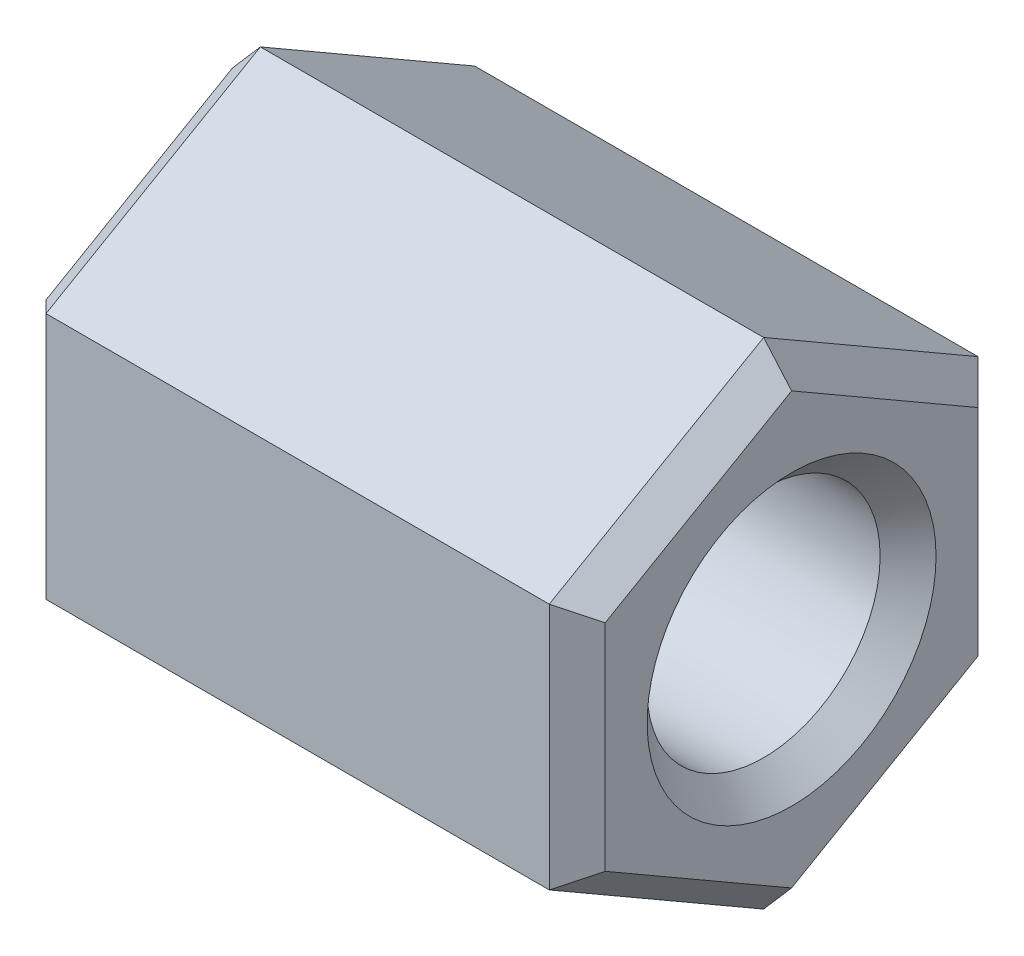
ISO-10303-21;
HEADER;
FILE_DESCRIPTION(('STEP AP214'),'2;1');
FILE_NAME('part.step','',(''),(''),'','','');
FILE_SCHEMA(('AUTOMOTIVE_DESIGN { 1 0 10303 214 1 1 1 1 }'));
ENDSEC;
DATA;
#1=APPLICATION_CONTEXT('core data for automotive mechanical design processes');
#2=APPLICATION_PROTOCOL_DEFINITION('international standard','automotive_design',2000,#1);
#3=PRODUCT_CONTEXT('',#1,'mechanical');
#4=PRODUCT('Part','Part','',(#3));
#5=PRODUCT_RELATED_PRODUCT_CATEGORY('part','',(#4));
#6=PRODUCT_DEFINITION_FORMATION('','',#4);
#7=PRODUCT_DEFINITION_CONTEXT('part definition',#1,'design');
#8=PRODUCT_DEFINITION('design','',#6,#7);
#9=PRODUCT_DEFINITION_SHAPE('','',#8);
#10=(LENGTH_UNIT() NAMED_UNIT(*) SI_UNIT(.MILLI.,.METRE.));
#11=(NAMED_UNIT(*) PLANE_ANGLE_UNIT() SI_UNIT($,.RADIAN.));
#12=(NAMED_UNIT(*) SI_UNIT($,.STERADIAN.) SOLID_ANGLE_UNIT());
#13=UNCERTAINTY_MEASURE_WITH_UNIT(LENGTH_MEASURE(1.E-05),#10,'distance_accuracy_value','');
#14=(GEOMETRIC_REPRESENTATION_CONTEXT(3) GLOBAL_UNCERTAINTY_ASSIGNED_CONTEXT((#13)) GLOBAL_UNIT_ASSIGNED_CONTEXT((#10,
#11,#12)) REPRESENTATION_CONTEXT('',''));
#15=CARTESIAN_POINT('',(0.,0.,0.));
#16=DIRECTION('',(0.,0.,1.));
#17=DIRECTION('',(1.,0.,0.));
#18=AXIS2_PLACEMENT_3D('',#15,#16,#17);
#19=CARTESIAN_POINT('',(6.,0.,0.));
#20=DIRECTION('',(1.,0.,0.));
#21=DIRECTION('',(0.,0.,-1.));
#22=AXIS2_PLACEMENT_3D('',#19,#20,#21);
#23=PLANE('',#22);
#24=CARTESIAN_POINT('',(6.,0.,0.));
#25=DIRECTION('',(1.,0.,0.));
#26=DIRECTION('',(0.,0.,-1.));
#27=AXIS2_PLACEMENT_3D('',#24,#25,#26);
#28=CIRCLE('',#27,1.55);
#29=CARTESIAN_POINT('',(6.,0.,-1.55));
#30=VERTEX_POINT('',#29);
#31=EDGE_CURVE('E11',#30,#30,#28,.F.);
#32=ORIENTED_EDGE('',*,*,#31,.T.);
#33=EDGE_LOOP('',(#32));
#34=FACE_BOUND('',#33,.T.);
#35=DIRECTION('',(0.,0.5,-0.866025403784439));
#36=VECTOR('',#35,1.);
#37=CARTESIAN_POINT('',(6.,-1.06809799800081,-2.15));
#38=LINE('',#37,#36);
#39=CARTESIAN_POINT('',(6.,-2.3094010767585,0.));
#40=VERTEX_POINT('',#39);
#41=CARTESIAN_POINT('',(6.,-1.15470053837925,-2.));
#42=VERTEX_POINT('',#41);
#43=EDGE_CURVE('E65',#40,#42,#38,.T.);
#44=ORIENTED_EDGE('',*,*,#43,.T.);
#45=DIRECTION('',(0.,1.,0.));
#46=VECTOR('',#45,1.);
#47=CARTESIAN_POINT('',(6.,1.32790561913614,-2.));
#48=LINE('',#47,#46);
#49=CARTESIAN_POINT('',(6.,1.15470053837925,-2.));
#50=VERTEX_POINT('',#49);
#51=EDGE_CURVE('E57',#42,#50,#48,.T.);
#52=ORIENTED_EDGE('',*,*,#51,.T.);
#53=DIRECTION('',(0.,0.5,0.866025403784439));
#54=VECTOR('',#53,1.);
#55=CARTESIAN_POINT('',(6.,2.39600361713695,0.15));
#56=LINE('',#55,#54);
#57=CARTESIAN_POINT('',(6.,2.30940107675851,0.));
#58=VERTEX_POINT('',#57);
#59=EDGE_CURVE('E204',#50,#58,#56,.T.);
#60=ORIENTED_EDGE('',*,*,#59,.T.);
#61=DIRECTION('',(0.,-0.5,0.866025403784438));
#62=VECTOR('',#61,1.);
#63=CARTESIAN_POINT('',(6.,1.06809799800081,2.15));
#64=LINE('',#63,#62);
#65=CARTESIAN_POINT('',(6.,1.15470053837925,2.));
#66=VERTEX_POINT('',#65);
#67=EDGE_CURVE('E206',#58,#66,#64,.T.);
#68=ORIENTED_EDGE('',*,*,#67,.T.);
#69=DIRECTION('',(0.,-1.,0.));
#70=VECTOR('',#69,1.);
#71=CARTESIAN_POINT('',(6.,-1.32790561913614,2.));
#72=LINE('',#71,#70);
#73=CARTESIAN_POINT('',(6.,-1.15470053837925,2.));
#74=VERTEX_POINT('',#73);
#75=EDGE_CURVE('E208',#66,#74,#72,.T.);
#76=ORIENTED_EDGE('',*,*,#75,.T.);
#77=DIRECTION('',(0.,-0.5,-0.866025403784439));
#78=VECTOR('',#77,1.);
#79=CARTESIAN_POINT('',(6.,-2.39600361713695,-0.149999999999998));
#80=LINE('',#79,#78);
#81=EDGE_CURVE('E70',#74,#40,#80,.T.);
#82=ORIENTED_EDGE('',*,*,#81,.T.);
#83=EDGE_LOOP('',(#44,#52,#60,#68,#76,#82));
#84=FACE_BOUND('',#83,.T.);
#85=ADVANCED_FACE('F47',(#34,#84),#23,.T.);
#86=CARTESIAN_POINT('',(0.,0.,0.));
#87=DIRECTION('',(1.,0.,0.));
#88=DIRECTION('',(0.,0.,-1.));
#89=AXIS2_PLACEMENT_3D('',#86,#87,#88);
#90=PLANE('',#89);
#91=CARTESIAN_POINT('',(0.,0.,0.));
#92=DIRECTION('',(1.,0.,0.));
#93=DIRECTION('',(0.,0.,-1.));
#94=AXIS2_PLACEMENT_3D('',#91,#92,#93);
#95=CIRCLE('',#94,1.55);
#96=CARTESIAN_POINT('',(0.,0.,1.55));
#97=VERTEX_POINT('',#96);
#98=EDGE_CURVE('E166',#97,#97,#95,.T.);
#99=ORIENTED_EDGE('',*,*,#98,.T.);
#100=EDGE_LOOP('',(#99));
#101=FACE_BOUND('',#100,.T.);
#102=DIRECTION('',(0.,1.,0.));
#103=VECTOR('',#102,1.);
#104=CARTESIAN_POINT('',(0.,0.,2.));
#105=LINE('',#104,#103);
#106=CARTESIAN_POINT('',(0.,-1.15470053837925,2.));
#107=VERTEX_POINT('',#106);
#108=CARTESIAN_POINT('',(0.,1.15470053837925,2.));
#109=VERTEX_POINT('',#108);
#110=EDGE_CURVE('E165',#107,#109,#105,.T.);
#111=ORIENTED_EDGE('',*,*,#110,.T.);
#112=DIRECTION('',(0.,0.5,-0.866025403784438));
#113=VECTOR('',#112,1.);
#114=CARTESIAN_POINT('',(0.,1.73205080756888,1.));
#115=LINE('',#114,#113);
#116=CARTESIAN_POINT('',(0.,2.3094010767585,0.));
#117=VERTEX_POINT('',#116);
#118=EDGE_CURVE('E144',#109,#117,#115,.T.);
#119=ORIENTED_EDGE('',*,*,#118,.T.);
#120=DIRECTION('',(0.,-0.5,-0.866025403784439));
#121=VECTOR('',#120,1.);
#122=CARTESIAN_POINT('',(0.,1.73205080756888,-1.));
#123=LINE('',#122,#121);
#124=CARTESIAN_POINT('',(0.,1.15470053837925,-2.));
#125=VERTEX_POINT('',#124);
#126=EDGE_CURVE('E154',#117,#125,#123,.T.);
#127=ORIENTED_EDGE('',*,*,#126,.T.);
#128=DIRECTION('',(0.,-1.,0.));
#129=VECTOR('',#128,1.);
#130=CARTESIAN_POINT('',(0.,0.,-2.));
#131=LINE('',#130,#129);
#132=CARTESIAN_POINT('',(0.,-1.15470053837925,-2.));
#133=VERTEX_POINT('',#132);
#134=EDGE_CURVE('E160',#125,#133,#131,.T.);
#135=ORIENTED_EDGE('',*,*,#134,.T.);
#136=DIRECTION('',(0.,-0.5,0.866025403784439));
#137=VECTOR('',#136,1.);
#138=CARTESIAN_POINT('',(0.,-1.73205080756888,-0.999999999999999));
#139=LINE('',#138,#137);
#140=CARTESIAN_POINT('',(0.,-2.3094010767585,0.));
#141=VERTEX_POINT('',#140);
#142=EDGE_CURVE('E266',#133,#141,#139,.T.);
#143=ORIENTED_EDGE('',*,*,#142,.T.);
#144=DIRECTION('',(0.,0.5,0.866025403784439));
#145=VECTOR('',#144,1.);
#146=CARTESIAN_POINT('',(0.,-1.73205080756888,1.));
#147=LINE('',#146,#145);
#148=EDGE_CURVE('E171',#141,#107,#147,.T.);
#149=ORIENTED_EDGE('',*,*,#148,.T.);
#150=EDGE_LOOP('',(#111,#119,#127,#135,#143,#149));
#151=FACE_BOUND('',#150,.T.);
#152=ADVANCED_FACE('F163',(#101,#151),#90,.F.);
#153=CARTESIAN_POINT('',(6.,1.32790561913614,-2.3));
#154=DIRECTION('',(0.,-0.866025403784439,0.5));
#155=DIRECTION('',(0.,-0.5,-0.866025403784439));
#156=AXIS2_PLACEMENT_3D('',#153,#154,#155);
#157=PLANE('',#156);
#158=DIRECTION('',(-1.,0.,0.));
#159=VECTOR('',#158,1.);
#160=CARTESIAN_POINT('',(6.,1.32790561913614,-2.3));
#161=LINE('',#160,#159);
#162=CARTESIAN_POINT('',(5.7,1.32790561913614,-2.3));
#163=VERTEX_POINT('',#162);
#164=CARTESIAN_POINT('',(0.3,1.32790561913614,-2.3));
#165=VERTEX_POINT('',#164);
#166=EDGE_CURVE('E223',#163,#165,#161,.T.);
#167=ORIENTED_EDGE('',*,*,#166,.T.);
#168=DIRECTION('',(0.,0.5,0.866025403784439));
#169=VECTOR('',#168,1.);
#170=CARTESIAN_POINT('',(0.3,1.32790561913614,-2.3));
#171=LINE('',#170,#169);
#172=CARTESIAN_POINT('',(0.3,2.65581123827228,0.));
#173=VERTEX_POINT('',#172);
#174=EDGE_CURVE('E202',#165,#173,#171,.T.);
#175=ORIENTED_EDGE('',*,*,#174,.T.);
#176=DIRECTION('',(-1.,0.,0.));
#177=VECTOR('',#176,1.);
#178=CARTESIAN_POINT('',(6.,2.65581123827228,0.));
#179=LINE('',#178,#177);
#180=CARTESIAN_POINT('',(5.7,2.65581123827228,0.));
#181=VERTEX_POINT('',#180);
#182=EDGE_CURVE('E161',#181,#173,#179,.T.);
#183=ORIENTED_EDGE('',*,*,#182,.F.);
#184=DIRECTION('',(0.,-0.5,-0.866025403784439));
#185=VECTOR('',#184,1.);
#186=CARTESIAN_POINT('',(5.7,1.32790561913614,-2.3));
#187=LINE('',#186,#185);
#188=EDGE_CURVE('E200',#181,#163,#187,.T.);
#189=ORIENTED_EDGE('',*,*,#188,.T.);
#190=EDGE_LOOP('',(#167,#175,#183,#189));
#191=FACE_BOUND('',#190,.T.);
#192=ADVANCED_FACE('F290',(#191),#157,.F.);
#193=CARTESIAN_POINT('',(6.,2.65581123827228,0.));
#194=DIRECTION('',(0.,-0.866025403784438,-0.5));
#195=DIRECTION('',(0.,0.5,-0.866025403784439));
#196=AXIS2_PLACEMENT_3D('',#193,#194,#195);
#197=PLANE('',#196);
#198=ORIENTED_EDGE('',*,*,#182,.T.);
#199=DIRECTION('',(0.,-0.5,0.866025403784439));
#200=VECTOR('',#199,1.);
#201=CARTESIAN_POINT('',(0.3,2.65581123827228,0.));
#202=LINE('',#201,#200);
#203=CARTESIAN_POINT('',(0.3,1.32790561913614,2.3));
#204=VERTEX_POINT('',#203);
#205=EDGE_CURVE('E147',#173,#204,#202,.T.);
#206=ORIENTED_EDGE('',*,*,#205,.T.);
#207=DIRECTION('',(-1.,0.,0.));
#208=VECTOR('',#207,1.);
#209=CARTESIAN_POINT('',(6.,1.32790561913614,2.3));
#210=LINE('',#209,#208);
#211=CARTESIAN_POINT('',(5.7,1.32790561913614,2.3));
#212=VERTEX_POINT('',#211);
#213=EDGE_CURVE('E252',#212,#204,#210,.T.);
#214=ORIENTED_EDGE('',*,*,#213,.F.);
#215=DIRECTION('',(0.,0.5,-0.866025403784439));
#216=VECTOR('',#215,1.);
#217=CARTESIAN_POINT('',(5.7,2.65581123827228,0.));
#218=LINE('',#217,#216);
#219=EDGE_CURVE('E180',#212,#181,#218,.T.);
#220=ORIENTED_EDGE('',*,*,#219,.T.);
#221=EDGE_LOOP('',(#198,#206,#214,#220));
#222=FACE_BOUND('',#221,.T.);
#223=ADVANCED_FACE('F257',(#222),#197,.F.);
#224=CARTESIAN_POINT('',(6.,1.32790561913614,2.3));
#225=DIRECTION('',(0.,0.,-1.));
#226=DIRECTION('',(0.,1.,0.));
#227=AXIS2_PLACEMENT_3D('',#224,#225,#226);
#228=PLANE('',#227);
#229=ORIENTED_EDGE('',*,*,#213,.T.);
#230=DIRECTION('',(0.,-1.,0.));
#231=VECTOR('',#230,1.);
#232=CARTESIAN_POINT('',(0.3,1.32790561913614,2.3));
#233=LINE('',#232,#231);
#234=CARTESIAN_POINT('',(0.3,-1.32790561913614,2.3));
#235=VERTEX_POINT('',#234);
#236=EDGE_CURVE('E185',#204,#235,#233,.T.);
#237=ORIENTED_EDGE('',*,*,#236,.T.);
#238=DIRECTION('',(-1.,0.,0.));
#239=VECTOR('',#238,1.);
#240=CARTESIAN_POINT('',(6.,-1.32790561913614,2.3));
#241=LINE('',#240,#239);
#242=CARTESIAN_POINT('',(5.7,-1.32790561913614,2.3));
#243=VERTEX_POINT('',#242);
#244=EDGE_CURVE('E254',#243,#235,#241,.T.);
#245=ORIENTED_EDGE('',*,*,#244,.F.);
#246=DIRECTION('',(0.,1.,0.));
#247=VECTOR('',#246,1.);
#248=CARTESIAN_POINT('',(5.7,1.32790561913614,2.3));
#249=LINE('',#248,#247);
#250=EDGE_CURVE('E183',#243,#212,#249,.T.);
#251=ORIENTED_EDGE('',*,*,#250,.T.);
#252=EDGE_LOOP('',(#229,#237,#245,#251));
#253=FACE_BOUND('',#252,.T.);
#254=ADVANCED_FACE('F251',(#253),#228,.F.);
#255=CARTESIAN_POINT('',(6.,-1.32790561913614,2.3));
#256=DIRECTION('',(0.,0.866025403784439,-0.5));
#257=DIRECTION('',(0.,0.5,0.866025403784439));
#258=AXIS2_PLACEMENT_3D('',#255,#256,#257);
#259=PLANE('',#258);
#260=ORIENTED_EDGE('',*,*,#244,.T.);
#261=DIRECTION('',(0.,-0.5,-0.866025403784439));
#262=VECTOR('',#261,1.);
#263=CARTESIAN_POINT('',(0.3,-1.32790561913614,2.3));
#264=LINE('',#263,#262);
#265=CARTESIAN_POINT('',(0.3,-2.65581123827228,0.));
#266=VERTEX_POINT('',#265);
#267=EDGE_CURVE('E189',#235,#266,#264,.T.);
#268=ORIENTED_EDGE('',*,*,#267,.T.);
#269=DIRECTION('',(-1.,0.,0.));
#270=VECTOR('',#269,1.);
#271=CARTESIAN_POINT('',(6.,-2.65581123827228,0.));
#272=LINE('',#271,#270);
#273=CARTESIAN_POINT('',(5.7,-2.65581123827228,0.));
#274=VERTEX_POINT('',#273);
#275=EDGE_CURVE('E261',#274,#266,#272,.T.);
#276=ORIENTED_EDGE('',*,*,#275,.F.);
#277=DIRECTION('',(0.,0.5,0.866025403784439));
#278=VECTOR('',#277,1.);
#279=CARTESIAN_POINT('',(5.7,-1.32790561913614,2.3));
#280=LINE('',#279,#278);
#281=EDGE_CURVE('E187',#274,#243,#280,.T.);
#282=ORIENTED_EDGE('',*,*,#281,.T.);
#283=EDGE_LOOP('',(#260,#268,#276,#282));
#284=FACE_BOUND('',#283,.T.);
#285=ADVANCED_FACE('F278',(#284),#259,.F.);
#286=CARTESIAN_POINT('',(6.,-2.65581123827228,0.));
#287=DIRECTION('',(0.,0.866025403784439,0.5));
#288=DIRECTION('',(0.,-0.5,0.866025403784439));
#289=AXIS2_PLACEMENT_3D('',#286,#287,#288);
#290=PLANE('',#289);
#291=ORIENTED_EDGE('',*,*,#275,.T.);
#292=DIRECTION('',(0.,0.5,-0.866025403784439));
#293=VECTOR('',#292,1.);
#294=CARTESIAN_POINT('',(0.3,-2.65581123827228,0.));
#295=LINE('',#294,#293);
#296=CARTESIAN_POINT('',(0.3,-1.32790561913614,-2.3));
#297=VERTEX_POINT('',#296);
#298=EDGE_CURVE('E193',#266,#297,#295,.T.);
#299=ORIENTED_EDGE('',*,*,#298,.T.);
#300=DIRECTION('',(-1.,0.,0.));
#301=VECTOR('',#300,1.);
#302=CARTESIAN_POINT('',(6.,-1.32790561913614,-2.3));
#303=LINE('',#302,#301);
#304=CARTESIAN_POINT('',(5.7,-1.32790561913614,-2.3));
#305=VERTEX_POINT('',#304);
#306=EDGE_CURVE('E283',#305,#297,#303,.T.);
#307=ORIENTED_EDGE('',*,*,#306,.F.);
#308=DIRECTION('',(0.,-0.5,0.866025403784439));
#309=VECTOR('',#308,1.);
#310=CARTESIAN_POINT('',(5.7,-2.65581123827228,0.));
#311=LINE('',#310,#309);
#312=EDGE_CURVE('E191',#305,#274,#311,.T.);
#313=ORIENTED_EDGE('',*,*,#312,.T.);
#314=EDGE_LOOP('',(#291,#299,#307,#313));
#315=FACE_BOUND('',#314,.T.);
#316=ADVANCED_FACE('F301',(#315),#290,.F.);
#317=CARTESIAN_POINT('',(6.,-1.32790561913614,-2.3));
#318=DIRECTION('',(0.,0.,1.));
#319=DIRECTION('',(1.,0.,0.));
#320=AXIS2_PLACEMENT_3D('',#317,#318,#319);
#321=PLANE('',#320);
#322=ORIENTED_EDGE('',*,*,#306,.T.);
#323=DIRECTION('',(0.,1.,0.));
#324=VECTOR('',#323,1.);
#325=CARTESIAN_POINT('',(0.3,-1.32790561913614,-2.3));
#326=LINE('',#325,#324);
#327=EDGE_CURVE('E198',#297,#165,#326,.T.);
#328=ORIENTED_EDGE('',*,*,#327,.T.);
#329=ORIENTED_EDGE('',*,*,#166,.F.);
#330=DIRECTION('',(0.,-1.,0.));
#331=VECTOR('',#330,1.);
#332=CARTESIAN_POINT('',(5.7,-1.32790561913614,-2.3));
#333=LINE('',#332,#331);
#334=EDGE_CURVE('E195',#163,#305,#333,.T.);
#335=ORIENTED_EDGE('',*,*,#334,.T.);
#336=EDGE_LOOP('',(#322,#328,#329,#335));
#337=FACE_BOUND('',#336,.T.);
#338=ADVANCED_FACE('F302',(#337),#321,.F.);
#339=CARTESIAN_POINT('',(6.,0.,0.));
#340=DIRECTION('',(-1.,0.,0.));
#341=DIRECTION('',(0.,0.,1.));
#342=AXIS2_PLACEMENT_3D('',#339,#340,#341);
#343=CYLINDRICAL_SURFACE('',#342,1.25);
#344=CARTESIAN_POINT('',(0.300000000000001,0.,0.));
#345=DIRECTION('',(1.,0.,0.));
#346=DIRECTION('',(0.,0.,-1.));
#347=AXIS2_PLACEMENT_3D('',#344,#345,#346);
#348=CIRCLE('',#347,1.25);
#349=CARTESIAN_POINT('',(0.300000000000001,0.,1.25));
#350=VERTEX_POINT('',#349);
#351=EDGE_CURVE('E177',#350,#350,#348,.F.);
#352=ORIENTED_EDGE('',*,*,#351,.T.);
#353=EDGE_LOOP('',(#352));
#354=FACE_BOUND('',#353,.T.);
#355=CARTESIAN_POINT('',(5.7,0.,0.));
#356=DIRECTION('',(1.,0.,0.));
#357=DIRECTION('',(0.,0.,-1.));
#358=AXIS2_PLACEMENT_3D('',#355,#356,#357);
#359=CIRCLE('',#358,1.25);
#360=CARTESIAN_POINT('',(5.7,0.,-1.25));
#361=VERTEX_POINT('',#360);
#362=EDGE_CURVE('E169',#361,#361,#359,.T.);
#363=ORIENTED_EDGE('',*,*,#362,.T.);
#364=EDGE_LOOP('',(#363));
#365=FACE_BOUND('',#364,.T.);
#366=ADVANCED_FACE('F321',(#354,#365),#343,.F.);
#367=CARTESIAN_POINT('',(0.,0.,0.));
#368=DIRECTION('',(-1.,0.,0.));
#369=DIRECTION('',(0.,0.,1.));
#370=AXIS2_PLACEMENT_3D('',#367,#368,#369);
#371=CONICAL_SURFACE('',#370,1.55,0.785398163397446);
#372=CARTESIAN_POINT('',(0.300000000000001,0.,1.25));
#373=CARTESIAN_POINT('',(0.296875000000001,0.,1.253125));
#374=CARTESIAN_POINT('',(0.293750000000001,0.,1.25625));
#375=CARTESIAN_POINT('',(0.287500000000001,0.,1.2625));
#376=CARTESIAN_POINT('',(0.284375000000001,0.,1.265625));
#377=CARTESIAN_POINT('',(0.278125000000001,0.,1.271875));
#378=CARTESIAN_POINT('',(0.275000000000001,0.,1.275));
#379=CARTESIAN_POINT('',(0.268750000000001,0.,1.28125));
#380=CARTESIAN_POINT('',(0.265625000000001,0.,1.284375));
#381=CARTESIAN_POINT('',(0.259375000000001,0.,1.290625));
#382=CARTESIAN_POINT('',(0.256250000000001,0.,1.29375));
#383=CARTESIAN_POINT('',(0.250000000000001,0.,1.3));
#384=CARTESIAN_POINT('',(0.246875000000001,0.,1.303125));
#385=CARTESIAN_POINT('',(0.240625000000001,0.,1.309375));
#386=CARTESIAN_POINT('',(0.237500000000001,0.,1.3125));
#387=CARTESIAN_POINT('',(0.231250000000001,0.,1.31875));
#388=CARTESIAN_POINT('',(0.228125000000001,0.,1.321875));
#389=CARTESIAN_POINT('',(0.221875000000001,0.,1.328125));
#390=CARTESIAN_POINT('',(0.218750000000001,0.,1.33125));
#391=CARTESIAN_POINT('',(0.212500000000001,0.,1.3375));
#392=CARTESIAN_POINT('',(0.209375000000001,0.,1.340625));
#393=CARTESIAN_POINT('',(0.203125,0.,1.346875));
#394=CARTESIAN_POINT('',(0.200000000000001,0.,1.35));
#395=CARTESIAN_POINT('',(0.19375,0.,1.35625));
#396=CARTESIAN_POINT('',(0.190625,0.,1.359375));
#397=CARTESIAN_POINT('',(0.184375,0.,1.365625));
#398=CARTESIAN_POINT('',(0.18125,0.,1.36875));
#399=CARTESIAN_POINT('',(0.175,0.,1.375));
#400=CARTESIAN_POINT('',(0.171875,0.,1.378125));
#401=CARTESIAN_POINT('',(0.165625,0.,1.384375));
#402=CARTESIAN_POINT('',(0.1625,0.,1.3875));
#403=CARTESIAN_POINT('',(0.15625,0.,1.39375));
#404=CARTESIAN_POINT('',(0.153125,0.,1.396875));
#405=CARTESIAN_POINT('',(0.146875,0.,1.403125));
#406=CARTESIAN_POINT('',(0.14375,0.,1.40625));
#407=CARTESIAN_POINT('',(0.1375,0.,1.4125));
#408=CARTESIAN_POINT('',(0.134375,0.,1.415625));
#409=CARTESIAN_POINT('',(0.128125,0.,1.421875));
#410=CARTESIAN_POINT('',(0.125,0.,1.425));
#411=CARTESIAN_POINT('',(0.11875,0.,1.43125));
#412=CARTESIAN_POINT('',(0.115625,0.,1.434375));
#413=CARTESIAN_POINT('',(0.109375,0.,1.440625));
#414=CARTESIAN_POINT('',(0.10625,0.,1.44375));
#415=CARTESIAN_POINT('',(0.1,0.,1.45));
#416=CARTESIAN_POINT('',(0.0968750000000003,0.,1.453125));
#417=CARTESIAN_POINT('',(0.0906250000000002,0.,1.459375));
#418=CARTESIAN_POINT('',(0.0875000000000002,0.,1.4625));
#419=CARTESIAN_POINT('',(0.0812500000000002,0.,1.46875));
#420=CARTESIAN_POINT('',(0.0781250000000002,0.,1.471875));
#421=CARTESIAN_POINT('',(0.0718750000000002,0.,1.478125));
#422=CARTESIAN_POINT('',(0.0687500000000002,0.,1.48125));
#423=CARTESIAN_POINT('',(0.0625000000000001,0.,1.4875));
#424=CARTESIAN_POINT('',(0.0593750000000001,0.,1.490625));
#425=CARTESIAN_POINT('',(0.0531250000000002,0.,1.496875));
#426=CARTESIAN_POINT('',(0.0500000000000002,0.,1.5));
#427=CARTESIAN_POINT('',(0.0437500000000001,0.,1.50625));
#428=CARTESIAN_POINT('',(0.0406250000000001,0.,1.509375));
#429=CARTESIAN_POINT('',(0.0343750000000001,0.,1.515625));
#430=CARTESIAN_POINT('',(0.03125,0.,1.51875));
#431=CARTESIAN_POINT('',(0.0250000000000001,0.,1.525));
#432=CARTESIAN_POINT('',(0.0218750000000001,0.,1.528125));
#433=CARTESIAN_POINT('',(0.0156250000000001,0.,1.534375));
#434=CARTESIAN_POINT('',(0.0125000000000001,0.,1.5375));
#435=CARTESIAN_POINT('',(0.00625,0.,1.54375));
#436=CARTESIAN_POINT('',(0.00312499999999997,0.,1.546875));
#437=CARTESIAN_POINT('',(0.,0.,1.55));
#438=B_SPLINE_CURVE_WITH_KNOTS('',3,(#372,#373,#374,#375,#376,#377,#378,#379,#380,#381,#382,
#383,#384,#385,#386,#387,#388,#389,#390,#391,#392,#393,#394,#395,#396,#397,#398,#399,#400,#401,
#402,#403,#404,#405,#406,#407,#408,#409,#410,#411,#412,#413,#414,#415,#416,#417,#418,#419,#420,
#421,#422,#423,#424,#425,#426,#427,#428,#429,#430,#431,#432,#433,#434,#435,#436,#437),
.UNSPECIFIED.,.F.,.F.,(4,2,2,2,2,2,2,2,2,2,2,2,2,2,2,2,2,2,2,2,2,2,2,2,2,2,2,2,2,2,2,2,4),(0.,
0.0132582521472478,0.0265165042944955,0.0397747564417433,0.0530330085889911,0.0662912607362388,
0.0795495128834866,0.0928077650307344,0.106066017177982,0.11932426932523,0.132582521472478,
0.145840773619725,0.159099025766973,0.172357277914221,0.185615530061469,0.198873782208717,
0.212132034355964,0.225390286503212,0.23864853865046,0.251906790797708,0.265165042944955,
0.278423295092203,0.291681547239451,0.304939799386699,0.318198051533946,0.331456303681194,
0.344714555828442,0.35797280797569,0.371231060122937,0.384489312270185,0.397747564417433,
0.411005816564681,0.424264068711929),.UNSPECIFIED.);
#439=EDGE_CURVE('BSEAM336',#350,#97,#438,.T.);
#440=ORIENTED_EDGE('',*,*,#351,.F.);
#441=ORIENTED_EDGE('',*,*,#98,.F.);
#442=ORIENTED_EDGE('',*,*,#439,.T.);
#443=ORIENTED_EDGE('',*,*,#439,.F.);
#444=EDGE_LOOP('',(#440,#442,#441,#443));
#445=FACE_BOUND('',#444,.T.);
#446=ADVANCED_FACE('F336',(#445),#371,.F.);
#447=CARTESIAN_POINT('',(0.3,-2.65581123827228,0.));
#448=DIRECTION('',(0.707106781186549,0.612372435695793,0.353553390593273));
#449=DIRECTION('',(0.,0.5,-0.866025403784439));
#450=AXIS2_PLACEMENT_3D('',#447,#448,#449);
#451=PLANE('',#450);
#452=DIRECTION('',(-0.654653670707976,0.755928946018455,0.));
#453=VECTOR('',#452,1.);
#454=CARTESIAN_POINT('',(0.3,-2.65581123827228,0.));
#455=LINE('',#454,#453);
#456=EDGE_CURVE('E217',#141,#266,#455,.F.);
#457=ORIENTED_EDGE('',*,*,#456,.F.);
#458=ORIENTED_EDGE('',*,*,#142,.F.);
#459=DIRECTION('',(-0.654653670707976,0.377964473009228,0.654653670707978));
#460=VECTOR('',#459,1.);
#461=CARTESIAN_POINT('',(0.3,-1.32790561913614,-2.3));
#462=LINE('',#461,#460);
#463=EDGE_CURVE('E220',#297,#133,#462,.T.);
#464=ORIENTED_EDGE('',*,*,#463,.F.);
#465=ORIENTED_EDGE('',*,*,#298,.F.);
#466=EDGE_LOOP('',(#457,#458,#464,#465));
#467=FACE_BOUND('',#466,.T.);
#468=ADVANCED_FACE('F299',(#467),#451,.F.);
#469=CARTESIAN_POINT('',(0.3,-1.32790561913614,-2.3));
#470=DIRECTION('',(0.707106781186549,0.,0.707106781186547));
#471=DIRECTION('',(0.,1.,0.));
#472=AXIS2_PLACEMENT_3D('',#469,#470,#471);
#473=PLANE('',#472);
#474=ORIENTED_EDGE('',*,*,#463,.T.);
#475=ORIENTED_EDGE('',*,*,#134,.F.);
#476=DIRECTION('',(-0.654653670707976,-0.377964473009228,0.654653670707978));
#477=VECTOR('',#476,1.);
#478=CARTESIAN_POINT('',(0.3,1.32790561913614,-2.3));
#479=LINE('',#478,#477);
#480=EDGE_CURVE('E157',#165,#125,#479,.T.);
#481=ORIENTED_EDGE('',*,*,#480,.F.);
#482=ORIENTED_EDGE('',*,*,#327,.F.);
#483=EDGE_LOOP('',(#474,#475,#481,#482));
#484=FACE_BOUND('',#483,.T.);
#485=ADVANCED_FACE('F296',(#484),#473,.F.);
#486=CARTESIAN_POINT('',(0.3,-1.32790561913614,2.3));
#487=DIRECTION('',(0.707106781186548,0.612372435695794,-0.353553390593273));
#488=DIRECTION('',(0.,-0.5,-0.866025403784439));
#489=AXIS2_PLACEMENT_3D('',#486,#487,#488);
#490=PLANE('',#489);
#491=ORIENTED_EDGE('',*,*,#456,.T.);
#492=ORIENTED_EDGE('',*,*,#267,.F.);
#493=DIRECTION('',(-0.654653670707976,0.377964473009227,-0.654653670707978));
#494=VECTOR('',#493,1.);
#495=CARTESIAN_POINT('',(0.3,-1.32790561913614,2.3));
#496=LINE('',#495,#494);
#497=EDGE_CURVE('E150',#107,#235,#496,.F.);
#498=ORIENTED_EDGE('',*,*,#497,.F.);
#499=ORIENTED_EDGE('',*,*,#148,.F.);
#500=EDGE_LOOP('',(#491,#492,#498,#499));
#501=FACE_BOUND('',#500,.T.);
#502=ADVANCED_FACE('F273',(#501),#490,.F.);
#503=CARTESIAN_POINT('',(0.3,1.32790561913614,-2.3));
#504=DIRECTION('',(0.707106781186549,-0.612372435695794,0.353553390593273));
#505=DIRECTION('',(0.,0.5,0.866025403784439));
#506=AXIS2_PLACEMENT_3D('',#503,#504,#505);
#507=PLANE('',#506);
#508=ORIENTED_EDGE('',*,*,#480,.T.);
#509=ORIENTED_EDGE('',*,*,#126,.F.);
#510=DIRECTION('',(0.654653670707976,0.755928946018456,0.));
#511=VECTOR('',#510,1.);
#512=CARTESIAN_POINT('',(-0.357142857142857,1.89700802733734,0.));
#513=LINE('',#512,#511);
#514=EDGE_CURVE('E140',#173,#117,#513,.F.);
#515=ORIENTED_EDGE('',*,*,#514,.F.);
#516=ORIENTED_EDGE('',*,*,#174,.F.);
#517=EDGE_LOOP('',(#508,#509,#515,#516));
#518=FACE_BOUND('',#517,.T.);
#519=ADVANCED_FACE('F155',(#518),#507,.F.);
#520=CARTESIAN_POINT('',(0.3,1.32790561913614,2.3));
#521=DIRECTION('',(0.707106781186548,0.,-0.707106781186547));
#522=DIRECTION('',(0.,-1.,0.));
#523=AXIS2_PLACEMENT_3D('',#520,#521,#522);
#524=PLANE('',#523);
#525=ORIENTED_EDGE('',*,*,#497,.T.);
#526=ORIENTED_EDGE('',*,*,#236,.F.);
#527=DIRECTION('',(-0.654653670707976,-0.377964473009228,-0.654653670707978));
#528=VECTOR('',#527,1.);
#529=CARTESIAN_POINT('',(0.3,1.32790561913614,2.3));
#530=LINE('',#529,#528);
#531=EDGE_CURVE('E151',#109,#204,#530,.F.);
#532=ORIENTED_EDGE('',*,*,#531,.F.);
#533=ORIENTED_EDGE('',*,*,#110,.F.);
#534=EDGE_LOOP('',(#525,#526,#532,#533));
#535=FACE_BOUND('',#534,.T.);
#536=ADVANCED_FACE('F276',(#535),#524,.F.);
#537=CARTESIAN_POINT('',(0.3,2.65581123827228,0.));
#538=DIRECTION('',(0.707106781186549,-0.612372435695793,-0.353553390593273));
#539=DIRECTION('',(0.,-0.5,0.866025403784439));
#540=AXIS2_PLACEMENT_3D('',#537,#538,#539);
#541=PLANE('',#540);
#542=ORIENTED_EDGE('',*,*,#514,.T.);
#543=ORIENTED_EDGE('',*,*,#118,.F.);
#544=ORIENTED_EDGE('',*,*,#531,.T.);
#545=ORIENTED_EDGE('',*,*,#205,.F.);
#546=EDGE_LOOP('',(#542,#543,#544,#545));
#547=FACE_BOUND('',#546,.T.);
#548=ADVANCED_FACE('F142',(#547),#541,.F.);
#549=CARTESIAN_POINT('',(5.7,0.,0.));
#550=DIRECTION('',(1.,0.,0.));
#551=DIRECTION('',(0.,0.,-1.));
#552=AXIS2_PLACEMENT_3D('',#549,#550,#551);
#553=CONICAL_SURFACE('',#552,1.25,0.785398163397449);
#554=ORIENTED_EDGE('',*,*,#31,.F.);
#555=EDGE_LOOP('',(#554));
#556=FACE_BOUND('',#555,.T.);
#557=ORIENTED_EDGE('',*,*,#362,.F.);
#558=EDGE_LOOP('',(#557));
#559=FACE_BOUND('',#558,.T.);
#560=ADVANCED_FACE('F350',(#556,#559),#553,.F.);
#561=CARTESIAN_POINT('',(6.,0.,2.));
#562=DIRECTION('',(0.707106781186545,0.,0.70710678118655));
#563=DIRECTION('',(0.,1.,0.));
#564=AXIS2_PLACEMENT_3D('',#561,#562,#563);
#565=PLANE('',#564);
#566=DIRECTION('',(0.65465367070798,-0.377964473009226,-0.654653670707976));
#567=VECTOR('',#566,1.);
#568=CARTESIAN_POINT('',(6.28571428571429,0.989743318610789,1.71428571428572));
#569=LINE('',#568,#567);
#570=EDGE_CURVE('E233',#212,#66,#569,.T.);
#571=ORIENTED_EDGE('',*,*,#570,.F.);
#572=ORIENTED_EDGE('',*,*,#250,.F.);
#573=DIRECTION('',(0.65465367070798,0.377964473009226,-0.654653670707975));
#574=VECTOR('',#573,1.);
#575=CARTESIAN_POINT('',(6.28571428571429,-0.989743318610789,1.71428571428572));
#576=LINE('',#575,#574);
#577=EDGE_CURVE('E52',#74,#243,#576,.F.);
#578=ORIENTED_EDGE('',*,*,#577,.F.);
#579=ORIENTED_EDGE('',*,*,#75,.F.);
#580=EDGE_LOOP('',(#571,#572,#578,#579));
#581=FACE_BOUND('',#580,.T.);
#582=ADVANCED_FACE('F50',(#581),#565,.T.);
#583=CARTESIAN_POINT('',(6.,-1.73205080756888,1.));
#584=DIRECTION('',(0.707106781186545,-0.612372435695796,0.353553390593275));
#585=DIRECTION('',(0.,0.5,0.866025403784439));
#586=AXIS2_PLACEMENT_3D('',#583,#584,#585);
#587=PLANE('',#586);
#588=ORIENTED_EDGE('',*,*,#577,.T.);
#589=ORIENTED_EDGE('',*,*,#281,.F.);
#590=DIRECTION('',(0.654653670707979,0.755928946018453,0.));
#591=VECTOR('',#590,1.);
#592=CARTESIAN_POINT('',(6.28571428571429,-1.97948663722158,0.));
#593=LINE('',#592,#591);
#594=EDGE_CURVE('E231',#40,#274,#593,.F.);
#595=ORIENTED_EDGE('',*,*,#594,.F.);
#596=ORIENTED_EDGE('',*,*,#81,.F.);
#597=EDGE_LOOP('',(#588,#589,#595,#596));
#598=FACE_BOUND('',#597,.T.);
#599=ADVANCED_FACE('F243',(#598),#587,.T.);
#600=CARTESIAN_POINT('',(6.,1.73205080756888,1.));
#601=DIRECTION('',(0.707106781186545,0.612372435695797,0.353553390593275));
#602=DIRECTION('',(0.,0.5,-0.866025403784439));
#603=AXIS2_PLACEMENT_3D('',#600,#601,#602);
#604=PLANE('',#603);
#605=ORIENTED_EDGE('',*,*,#570,.T.);
#606=ORIENTED_EDGE('',*,*,#67,.F.);
#607=DIRECTION('',(0.654653670707979,-0.755928946018453,0.));
#608=VECTOR('',#607,1.);
#609=CARTESIAN_POINT('',(6.28571428571429,1.97948663722158,0.));
#610=LINE('',#609,#608);
#611=EDGE_CURVE('E228',#181,#58,#610,.T.);
#612=ORIENTED_EDGE('',*,*,#611,.F.);
#613=ORIENTED_EDGE('',*,*,#219,.F.);
#614=EDGE_LOOP('',(#605,#606,#612,#613));
#615=FACE_BOUND('',#614,.T.);
#616=ADVANCED_FACE('F396',(#615),#604,.T.);
#617=CARTESIAN_POINT('',(6.,-1.73205080756888,-1.));
#618=DIRECTION('',(0.707106781186546,-0.612372435695796,-0.353553390593275));
#619=DIRECTION('',(0.,-0.5,0.866025403784439));
#620=AXIS2_PLACEMENT_3D('',#617,#618,#619);
#621=PLANE('',#620);
#622=ORIENTED_EDGE('',*,*,#594,.T.);
#623=ORIENTED_EDGE('',*,*,#312,.F.);
#624=DIRECTION('',(0.654653670707979,0.377964473009227,0.654653670707975));
#625=VECTOR('',#624,1.);
#626=CARTESIAN_POINT('',(6.28571428571429,-0.989743318610787,-1.71428571428572));
#627=LINE('',#626,#625);
#628=EDGE_CURVE('E226',#42,#305,#627,.F.);
#629=ORIENTED_EDGE('',*,*,#628,.F.);
#630=ORIENTED_EDGE('',*,*,#43,.F.);
#631=EDGE_LOOP('',(#622,#623,#629,#630));
#632=FACE_BOUND('',#631,.T.);
#633=ADVANCED_FACE('F390',(#632),#621,.T.);
#634=CARTESIAN_POINT('',(6.,1.73205080756888,-1.));
#635=DIRECTION('',(0.707106781186546,0.612372435695796,-0.353553390593275));
#636=DIRECTION('',(0.,-0.5,-0.866025403784439));
#637=AXIS2_PLACEMENT_3D('',#634,#635,#636);
#638=PLANE('',#637);
#639=ORIENTED_EDGE('',*,*,#611,.T.);
#640=ORIENTED_EDGE('',*,*,#59,.F.);
#641=DIRECTION('',(-0.654653670707979,0.377964473009227,-0.654653670707975));
#642=VECTOR('',#641,1.);
#643=CARTESIAN_POINT('',(6.28571428571429,0.989743318610789,-1.71428571428572));
#644=LINE('',#643,#642);
#645=EDGE_CURVE('E224',#163,#50,#644,.F.);
#646=ORIENTED_EDGE('',*,*,#645,.F.);
#647=ORIENTED_EDGE('',*,*,#188,.F.);
#648=EDGE_LOOP('',(#639,#640,#646,#647));
#649=FACE_BOUND('',#648,.T.);
#650=ADVANCED_FACE('F310',(#649),#638,.T.);
#651=CARTESIAN_POINT('',(6.,0.,-2.));
#652=DIRECTION('',(0.707106781186545,0.,-0.70710678118655));
#653=DIRECTION('',(0.,-1.,0.));
#654=AXIS2_PLACEMENT_3D('',#651,#652,#653);
#655=PLANE('',#654);
#656=ORIENTED_EDGE('',*,*,#628,.T.);
#657=ORIENTED_EDGE('',*,*,#334,.F.);
#658=ORIENTED_EDGE('',*,*,#645,.T.);
#659=ORIENTED_EDGE('',*,*,#51,.F.);
#660=EDGE_LOOP('',(#656,#657,#658,#659));
#661=FACE_BOUND('',#660,.T.);
#662=ADVANCED_FACE('F305',(#661),#655,.T.);
#663=CLOSED_SHELL('',(#85,#152,#192,#223,#254,#285,#316,#338,#366,#446,#468,#485,#502,#519,#536,
#548,#560,#582,#599,#616,#633,#650,#662));
#664=MANIFOLD_SOLID_BREP('B2',#663);
#665=ADVANCED_BREP_SHAPE_REPRESENTATION('',(#18,#664),#14);
#666=SHAPE_DEFINITION_REPRESENTATION(#9,#665);
ENDSEC;
END-ISO-10303-21;
